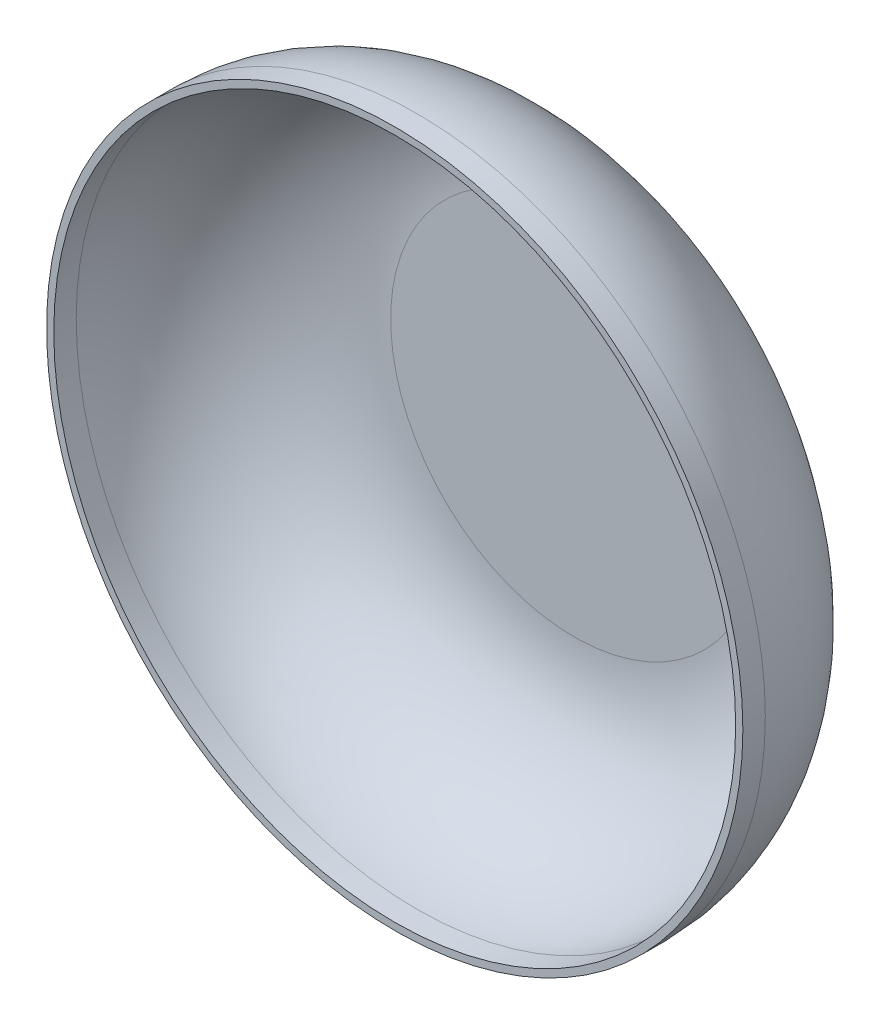
ISO-10303-21;
HEADER;
FILE_DESCRIPTION(('STEP AP214'),'2;1');
FILE_NAME('part.step','',(''),(''),'','','');
FILE_SCHEMA(('AUTOMOTIVE_DESIGN { 1 0 10303 214 1 1 1 1 }'));
ENDSEC;
DATA;
#1=APPLICATION_CONTEXT('core data for automotive mechanical design processes');
#2=APPLICATION_PROTOCOL_DEFINITION('international standard','automotive_design',2000,#1);
#3=PRODUCT_CONTEXT('',#1,'mechanical');
#4=PRODUCT('Part','Part','',(#3));
#5=PRODUCT_RELATED_PRODUCT_CATEGORY('part','',(#4));
#6=PRODUCT_DEFINITION_FORMATION('','',#4);
#7=PRODUCT_DEFINITION_CONTEXT('part definition',#1,'design');
#8=PRODUCT_DEFINITION('design','',#6,#7);
#9=PRODUCT_DEFINITION_SHAPE('','',#8);
#10=(LENGTH_UNIT() NAMED_UNIT(*) SI_UNIT(.MILLI.,.METRE.));
#11=(NAMED_UNIT(*) PLANE_ANGLE_UNIT() SI_UNIT($,.RADIAN.));
#12=(NAMED_UNIT(*) SI_UNIT($,.STERADIAN.) SOLID_ANGLE_UNIT());
#13=UNCERTAINTY_MEASURE_WITH_UNIT(LENGTH_MEASURE(1.E-05),#10,'distance_accuracy_value','');
#14=(GEOMETRIC_REPRESENTATION_CONTEXT(3) GLOBAL_UNCERTAINTY_ASSIGNED_CONTEXT((#13)) GLOBAL_UNIT_ASSIGNED_CONTEXT((#10,
#11,#12)) REPRESENTATION_CONTEXT('',''));
#15=CARTESIAN_POINT('',(0.,0.,0.));
#16=DIRECTION('',(0.,0.,1.));
#17=DIRECTION('',(1.,0.,0.));
#18=AXIS2_PLACEMENT_3D('',#15,#16,#17);
#19=CARTESIAN_POINT('',(0.,0.,-416.));
#20=DIRECTION('',(0.,0.,-1.));
#21=DIRECTION('',(-1.,0.,0.));
#22=AXIS2_PLACEMENT_3D('',#19,#20,#21);
#23=PLANE('',#22);
#24=CARTESIAN_POINT('',(0.,0.,-416.));
#25=DIRECTION('',(0.,0.,1.));
#26=DIRECTION('',(1.,0.,0.));
#27=AXIS2_PLACEMENT_3D('',#24,#25,#26);
#28=CIRCLE('',#27,409.);
#29=CARTESIAN_POINT('',(409.,0.,-416.));
#30=VERTEX_POINT('',#29);
#31=EDGE_CURVE('E68',#30,#30,#28,.T.);
#32=ORIENTED_EDGE('',*,*,#31,.F.);
#33=EDGE_LOOP('',(#32));
#34=FACE_BOUND('',#33,.T.);
#35=ADVANCED_FACE('F41',(#34),#23,.T.);
#36=CARTESIAN_POINT('',(409.,0.,-400.));
#37=DIRECTION('',(0.,0.,1.));
#38=DIRECTION('',(1.,0.,0.));
#39=AXIS2_PLACEMENT_3D('',#36,#37,#38);
#40=PLANE('',#39);
#41=CARTESIAN_POINT('',(0.,0.,-400.));
#42=DIRECTION('',(0.,0.,1.));
#43=DIRECTION('',(1.,0.,0.));
#44=AXIS2_PLACEMENT_3D('',#41,#42,#43);
#45=CIRCLE('',#44,409.);
#46=CARTESIAN_POINT('',(409.,0.,-400.));
#47=VERTEX_POINT('',#46);
#48=EDGE_CURVE('E10',#47,#47,#45,.T.);
#49=ORIENTED_EDGE('',*,*,#48,.T.);
#50=EDGE_LOOP('',(#49));
#51=FACE_BOUND('',#50,.T.);
#52=ADVANCED_FACE('F77',(#51),#40,.T.);
#53=CARTESIAN_POINT('',(0.,0.,-50.));
#54=DIRECTION('',(0.,0.,1.));
#55=DIRECTION('',(1.,0.,0.));
#56=AXIS2_PLACEMENT_3D('',#53,#54,#55);
#57=TOROIDAL_SURFACE('',#56,409.,350.);
#58=CARTESIAN_POINT('',(0.,0.,-50.));
#59=DIRECTION('',(0.,0.,1.));
#60=DIRECTION('',(1.,0.,0.));
#61=AXIS2_PLACEMENT_3D('',#58,#59,#60);
#62=CIRCLE('',#61,759.);
#63=CARTESIAN_POINT('',(759.,0.,-50.));
#64=VERTEX_POINT('',#63);
#65=EDGE_CURVE('E48',#64,#64,#62,.T.);
#66=ORIENTED_EDGE('',*,*,#65,.T.);
#67=EDGE_LOOP('',(#66));
#68=FACE_BOUND('',#67,.T.);
#69=ORIENTED_EDGE('',*,*,#48,.F.);
#70=EDGE_LOOP('',(#69));
#71=FACE_BOUND('',#70,.T.);
#72=ADVANCED_FACE('F81',(#68,#71),#57,.F.);
#73=CARTESIAN_POINT('',(0.,0.,0.));
#74=DIRECTION('',(0.,0.,1.));
#75=DIRECTION('',(1.,0.,0.));
#76=AXIS2_PLACEMENT_3D('',#73,#74,#75);
#77=CYLINDRICAL_SURFACE('',#76,759.);
#78=CARTESIAN_POINT('',(0.,0.,0.));
#79=DIRECTION('',(0.,0.,1.));
#80=DIRECTION('',(1.,0.,0.));
#81=AXIS2_PLACEMENT_3D('',#78,#79,#80);
#82=CIRCLE('',#81,759.);
#83=CARTESIAN_POINT('',(759.,0.,0.));
#84=VERTEX_POINT('',#83);
#85=EDGE_CURVE('E53',#84,#84,#82,.T.);
#86=ORIENTED_EDGE('',*,*,#85,.T.);
#87=EDGE_LOOP('',(#86));
#88=FACE_BOUND('',#87,.T.);
#89=ORIENTED_EDGE('',*,*,#65,.F.);
#90=EDGE_LOOP('',(#89));
#91=FACE_BOUND('',#90,.T.);
#92=ADVANCED_FACE('F85',(#88,#91),#77,.F.);
#93=CARTESIAN_POINT('',(759.,0.,0.));
#94=DIRECTION('',(0.,0.,1.));
#95=DIRECTION('',(1.,0.,0.));
#96=AXIS2_PLACEMENT_3D('',#93,#94,#95);
#97=PLANE('',#96);
#98=CARTESIAN_POINT('',(0.,0.,0.));
#99=DIRECTION('',(0.,0.,1.));
#100=DIRECTION('',(1.,0.,0.));
#101=AXIS2_PLACEMENT_3D('',#98,#99,#100);
#102=CIRCLE('',#101,775.);
#103=CARTESIAN_POINT('',(775.,0.,0.));
#104=VERTEX_POINT('',#103);
#105=EDGE_CURVE('E58',#104,#104,#102,.T.);
#106=ORIENTED_EDGE('',*,*,#105,.T.);
#107=EDGE_LOOP('',(#106));
#108=FACE_BOUND('',#107,.T.);
#109=ORIENTED_EDGE('',*,*,#85,.F.);
#110=EDGE_LOOP('',(#109));
#111=FACE_BOUND('',#110,.T.);
#112=ADVANCED_FACE('F90',(#108,#111),#97,.T.);
#113=CARTESIAN_POINT('',(0.,0.,0.));
#114=DIRECTION('',(0.,0.,1.));
#115=DIRECTION('',(1.,0.,0.));
#116=AXIS2_PLACEMENT_3D('',#113,#114,#115);
#117=CYLINDRICAL_SURFACE('',#116,775.);
#118=CARTESIAN_POINT('',(0.,0.,-50.));
#119=DIRECTION('',(0.,0.,1.));
#120=DIRECTION('',(1.,0.,0.));
#121=AXIS2_PLACEMENT_3D('',#118,#119,#120);
#122=CIRCLE('',#121,775.);
#123=CARTESIAN_POINT('',(775.,0.,-50.));
#124=VERTEX_POINT('',#123);
#125=EDGE_CURVE('E64',#124,#124,#122,.T.);
#126=ORIENTED_EDGE('',*,*,#125,.T.);
#127=EDGE_LOOP('',(#126));
#128=FACE_BOUND('',#127,.T.);
#129=ORIENTED_EDGE('',*,*,#105,.F.);
#130=EDGE_LOOP('',(#129));
#131=FACE_BOUND('',#130,.T.);
#132=ADVANCED_FACE('F94',(#128,#131),#117,.T.);
#133=CARTESIAN_POINT('',(0.,0.,-50.));
#134=DIRECTION('',(0.,0.,1.));
#135=DIRECTION('',(1.,0.,0.));
#136=AXIS2_PLACEMENT_3D('',#133,#134,#135);
#137=TOROIDAL_SURFACE('',#136,409.,366.);
#138=ORIENTED_EDGE('',*,*,#31,.T.);
#139=EDGE_LOOP('',(#138));
#140=FACE_BOUND('',#139,.T.);
#141=ORIENTED_EDGE('',*,*,#125,.F.);
#142=EDGE_LOOP('',(#141));
#143=FACE_BOUND('',#142,.T.);
#144=ADVANCED_FACE('F73',(#140,#143),#137,.T.);
#145=CLOSED_SHELL('',(#35,#52,#72,#92,#112,#132,#144));
#146=MANIFOLD_SOLID_BREP('B2',#145);
#147=ADVANCED_BREP_SHAPE_REPRESENTATION('',(#18,#146),#14);
#148=SHAPE_DEFINITION_REPRESENTATION(#9,#147);
ENDSEC;
END-ISO-10303-21;
